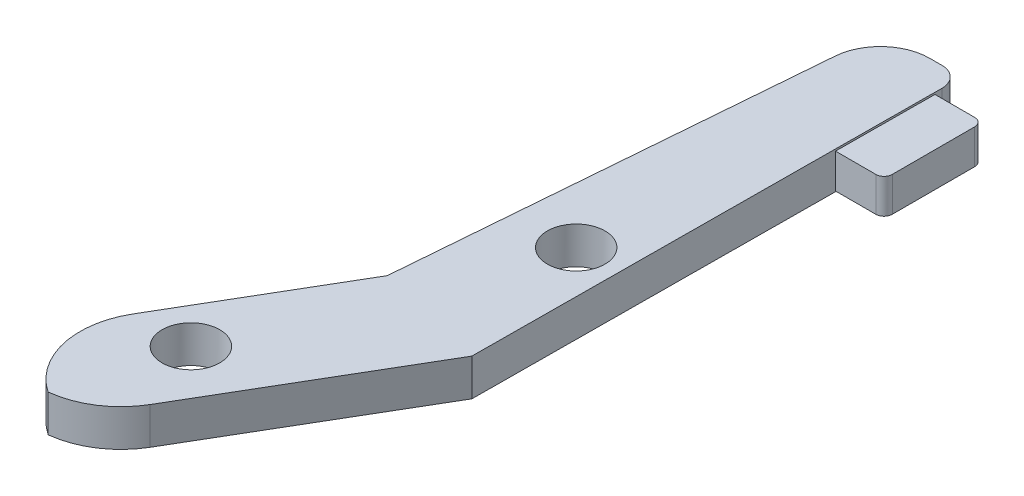
ISO-10303-21;
HEADER;
FILE_DESCRIPTION(('STEP AP214'),'2;1');
FILE_NAME('part.step','',(''),(''),'','','');
FILE_SCHEMA(('AUTOMOTIVE_DESIGN { 1 0 10303 214 1 1 1 1 }'));
ENDSEC;
DATA;
#1=APPLICATION_CONTEXT('core data for automotive mechanical design processes');
#2=APPLICATION_PROTOCOL_DEFINITION('international standard','automotive_design',2000,#1);
#3=PRODUCT_CONTEXT('',#1,'mechanical');
#4=PRODUCT('Part','Part','',(#3));
#5=PRODUCT_RELATED_PRODUCT_CATEGORY('part','',(#4));
#6=PRODUCT_DEFINITION_FORMATION('','',#4);
#7=PRODUCT_DEFINITION_CONTEXT('part definition',#1,'design');
#8=PRODUCT_DEFINITION('design','',#6,#7);
#9=PRODUCT_DEFINITION_SHAPE('','',#8);
#10=(LENGTH_UNIT() NAMED_UNIT(*) SI_UNIT(.MILLI.,.METRE.));
#11=(NAMED_UNIT(*) PLANE_ANGLE_UNIT() SI_UNIT($,.RADIAN.));
#12=(NAMED_UNIT(*) SI_UNIT($,.STERADIAN.) SOLID_ANGLE_UNIT());
#13=UNCERTAINTY_MEASURE_WITH_UNIT(LENGTH_MEASURE(1.E-05),#10,'distance_accuracy_value','');
#14=(GEOMETRIC_REPRESENTATION_CONTEXT(3) GLOBAL_UNCERTAINTY_ASSIGNED_CONTEXT((#13)) GLOBAL_UNIT_ASSIGNED_CONTEXT((#10,
#11,#12)) REPRESENTATION_CONTEXT('',''));
#15=CARTESIAN_POINT('',(0.,0.,0.));
#16=DIRECTION('',(0.,0.,1.));
#17=DIRECTION('',(1.,0.,0.));
#18=AXIS2_PLACEMENT_3D('',#15,#16,#17);
#19=CARTESIAN_POINT('',(15.9043578339676,2.25,-13.8697629262268));
#20=DIRECTION('',(-0.86267544127674,0.,-0.50575792926852));
#21=DIRECTION('',(-0.50575792926852,0.,0.862675441276741));
#22=AXIS2_PLACEMENT_3D('',#19,#20,#21);
#23=PLANE('',#22);
#24=DIRECTION('',(0.50575792926852,0.,-0.86267544127674));
#25=VECTOR('',#24,1.);
#26=CARTESIAN_POINT('',(15.9043578339676,2.25,-13.8697629262268));
#27=LINE('',#26,#25);
#28=CARTESIAN_POINT('',(8.68296696085208,2.25,-1.55217738267079));
#29=VERTEX_POINT('',#28);
#30=CARTESIAN_POINT('',(15.9043578339676,2.25,-13.8697629262268));
#31=VERTEX_POINT('',#30);
#32=EDGE_CURVE('E185',#29,#31,#27,.T.);
#33=ORIENTED_EDGE('',*,*,#32,.F.);
#34=DIRECTION('',(0.,-1.,0.));
#35=VECTOR('',#34,1.);
#36=CARTESIAN_POINT('',(8.68296696085208,2.25,-1.55217738267079));
#37=LINE('',#36,#35);
#38=CARTESIAN_POINT('',(8.68296696085208,0.,-1.55217738267079));
#39=VERTEX_POINT('',#38);
#40=EDGE_CURVE('E227',#29,#39,#37,.T.);
#41=ORIENTED_EDGE('',*,*,#40,.T.);
#42=DIRECTION('',(0.50575792926852,0.,-0.86267544127674));
#43=VECTOR('',#42,1.);
#44=CARTESIAN_POINT('',(15.9043578339676,0.,-13.8697629262268));
#45=LINE('',#44,#43);
#46=CARTESIAN_POINT('',(15.9043578339676,0.,-13.8697629262268));
#47=VERTEX_POINT('',#46);
#48=EDGE_CURVE('E204',#39,#47,#45,.T.);
#49=ORIENTED_EDGE('',*,*,#48,.T.);
#50=DIRECTION('',(0.,-1.,0.));
#51=VECTOR('',#50,1.);
#52=CARTESIAN_POINT('',(15.9043578339676,2.25,-13.8697629262268));
#53=LINE('',#52,#51);
#54=EDGE_CURVE('E223',#31,#47,#53,.T.);
#55=ORIENTED_EDGE('',*,*,#54,.F.);
#56=EDGE_LOOP('',(#33,#41,#49,#55));
#57=FACE_BOUND('',#56,.T.);
#58=ADVANCED_FACE('F39',(#57),#23,.F.);
#59=CARTESIAN_POINT('',(15.9043578339676,2.25,-13.8697629262268));
#60=DIRECTION('',(-0.99997752220081,0.,-0.00670485593638969));
#61=DIRECTION('',(-0.00670485593638969,0.,0.99997752220081));
#62=AXIS2_PLACEMENT_3D('',#59,#60,#61);
#63=PLANE('',#62);
#64=DIRECTION('',(0.,-1.,0.));
#65=VECTOR('',#64,1.);
#66=CARTESIAN_POINT('',(16.0514394846908,2.13615947214331,-35.8058561170146));
#67=LINE('',#66,#65);
#68=CARTESIAN_POINT('',(16.0514394846908,2.13615947214331,-35.8058561170146));
#69=VERTEX_POINT('',#68);
#70=CARTESIAN_POINT('',(16.0514394846908,0.0361594721433132,-35.8058561170146));
#71=VERTEX_POINT('',#70);
#72=EDGE_CURVE('E152',#69,#71,#67,.T.);
#73=ORIENTED_EDGE('',*,*,#72,.F.);
#74=DIRECTION('',(-0.00670485593638969,0.,0.99997752220081));
#75=VECTOR('',#74,1.);
#76=CARTESIAN_POINT('',(16.091382842704,2.13615947214331,-41.7630997257237));
#77=LINE('',#76,#75);
#78=CARTESIAN_POINT('',(16.0916695245919,2.13615947214331,-41.8058561170146));
#79=VERTEX_POINT('',#78);
#80=EDGE_CURVE('E156',#79,#69,#77,.T.);
#81=ORIENTED_EDGE('',*,*,#80,.F.);
#82=DIRECTION('',(0.,1.,0.));
#83=VECTOR('',#82,1.);
#84=CARTESIAN_POINT('',(16.0916695245919,2.13615947214331,-41.8058561170146));
#85=LINE('',#84,#83);
#86=CARTESIAN_POINT('',(16.0916695245919,0.0361594721433136,-41.8058561170146));
#87=VERTEX_POINT('',#86);
#88=EDGE_CURVE('E180',#87,#79,#85,.T.);
#89=ORIENTED_EDGE('',*,*,#88,.F.);
#90=DIRECTION('',(0.00670485593638969,0.,-0.99997752220081));
#91=VECTOR('',#90,1.);
#92=CARTESIAN_POINT('',(16.091382842704,0.0361594721433136,-41.7630997257237));
#93=LINE('',#92,#91);
#94=EDGE_CURVE('E168',#71,#87,#93,.T.);
#95=ORIENTED_EDGE('',*,*,#94,.F.);
#96=EDGE_LOOP('',(#73,#81,#89,#95));
#97=FACE_BOUND('',#96,.T.);
#98=DIRECTION('',(0.00670485593638969,0.,-0.99997752220081));
#99=VECTOR('',#98,1.);
#100=CARTESIAN_POINT('',(15.9043578339676,0.,-13.8697629262268));
#101=LINE('',#100,#99);
#102=CARTESIAN_POINT('',(16.0944943480357,0.,-42.2271567347668));
#103=VERTEX_POINT('',#102);
#104=EDGE_CURVE('E207',#47,#103,#101,.T.);
#105=ORIENTED_EDGE('',*,*,#104,.T.);
#106=DIRECTION('',(0.,-1.,0.));
#107=VECTOR('',#106,1.);
#108=CARTESIAN_POINT('',(16.0944943480357,2.25,-42.2271567347668));
#109=LINE('',#108,#107);
#110=CARTESIAN_POINT('',(16.0944943480357,2.25,-42.2271567347668));
#111=VERTEX_POINT('',#110);
#112=EDGE_CURVE('E271',#103,#111,#109,.F.);
#113=ORIENTED_EDGE('',*,*,#112,.T.);
#114=DIRECTION('',(0.00670485593638969,0.,-0.99997752220081));
#115=VECTOR('',#114,1.);
#116=CARTESIAN_POINT('',(15.9043578339676,2.25,-13.8697629262268));
#117=LINE('',#116,#115);
#118=EDGE_CURVE('E188',#31,#111,#117,.T.);
#119=ORIENTED_EDGE('',*,*,#118,.F.);
#120=ORIENTED_EDGE('',*,*,#54,.T.);
#121=EDGE_LOOP('',(#105,#113,#119,#120));
#122=FACE_BOUND('',#121,.T.);
#123=ADVANCED_FACE('F166',(#97,#122),#63,.F.);
#124=CARTESIAN_POINT('',(16.1025943033403,2.25,-43.4352025618905));
#125=DIRECTION('',(0.,0.,1.));
#126=DIRECTION('',(1.,0.,0.));
#127=AXIS2_PLACEMENT_3D('',#124,#125,#126);
#128=PLANE('',#127);
#129=DIRECTION('',(-1.,0.,0.));
#130=VECTOR('',#129,1.);
#131=CARTESIAN_POINT('',(16.1025943033403,2.25,-43.4352025618905));
#132=LINE('',#131,#130);
#133=CARTESIAN_POINT('',(14.8945213213947,2.25,-43.4352025618905));
#134=VERTEX_POINT('',#133);
#135=CARTESIAN_POINT('',(14.1482346901652,2.25,-43.4352025618905));
#136=VERTEX_POINT('',#135);
#137=EDGE_CURVE('E193',#134,#136,#132,.T.);
#138=ORIENTED_EDGE('',*,*,#137,.F.);
#139=DIRECTION('',(0.,-1.,0.));
#140=VECTOR('',#139,1.);
#141=CARTESIAN_POINT('',(14.8945213213947,2.25,-43.4352025618905));
#142=LINE('',#141,#140);
#143=CARTESIAN_POINT('',(14.8945213213947,0.,-43.4352025618905));
#144=VERTEX_POINT('',#143);
#145=EDGE_CURVE('E264',#134,#144,#142,.T.);
#146=ORIENTED_EDGE('',*,*,#145,.T.);
#147=DIRECTION('',(-1.,0.,0.));
#148=VECTOR('',#147,1.);
#149=CARTESIAN_POINT('',(16.1025943033403,0.,-43.4352025618905));
#150=LINE('',#149,#148);
#151=CARTESIAN_POINT('',(14.1482346901652,0.,-43.4352025618905));
#152=VERTEX_POINT('',#151);
#153=EDGE_CURVE('E211',#144,#152,#150,.T.);
#154=ORIENTED_EDGE('',*,*,#153,.T.);
#155=DIRECTION('',(0.,-1.,0.));
#156=VECTOR('',#155,1.);
#157=CARTESIAN_POINT('',(14.1482346901652,2.25,-43.4352025618905));
#158=LINE('',#157,#156);
#159=EDGE_CURVE('E257',#152,#136,#158,.F.);
#160=ORIENTED_EDGE('',*,*,#159,.T.);
#161=EDGE_LOOP('',(#138,#146,#154,#160));
#162=FACE_BOUND('',#161,.T.);
#163=ADVANCED_FACE('F352',(#162),#128,.F.);
#164=CARTESIAN_POINT('',(9.10364272683336,2.25,-15.5281579429813));
#165=DIRECTION('',(0.996680164961042,0.,0.0814165141309143));
#166=DIRECTION('',(0.0814165141309143,0.,-0.996680164961043));
#167=AXIS2_PLACEMENT_3D('',#164,#165,#166);
#168=PLANE('',#167);
#169=DIRECTION('',(-0.0814165141309143,0.,0.996680164961042));
#170=VECTOR('',#169,1.);
#171=CARTESIAN_POINT('',(9.10364272683336,2.25,-15.5281579429813));
#172=LINE('',#171,#170);
#173=CARTESIAN_POINT('',(11.1581941952821,2.25,-40.6794521042833));
#174=VERTEX_POINT('',#173);
#175=CARTESIAN_POINT('',(9.10364272683336,2.25,-15.5281579429813));
#176=VERTEX_POINT('',#175);
#177=EDGE_CURVE('E196',#174,#176,#172,.T.);
#178=ORIENTED_EDGE('',*,*,#177,.F.);
#179=DIRECTION('',(0.,-1.,0.));
#180=VECTOR('',#179,1.);
#181=CARTESIAN_POINT('',(11.1581941952821,2.25,-40.6794521042833));
#182=LINE('',#181,#180);
#183=CARTESIAN_POINT('',(11.1581941952821,0.,-40.6794521042833));
#184=VERTEX_POINT('',#183);
#185=EDGE_CURVE('E246',#174,#184,#182,.T.);
#186=ORIENTED_EDGE('',*,*,#185,.T.);
#187=DIRECTION('',(-0.0814165141309143,0.,0.996680164961042));
#188=VECTOR('',#187,1.);
#189=CARTESIAN_POINT('',(9.10364272683336,0.,-15.5281579429813));
#190=LINE('',#189,#188);
#191=CARTESIAN_POINT('',(9.10364272683336,0.,-15.5281579429813));
#192=VERTEX_POINT('',#191);
#193=EDGE_CURVE('E214',#184,#192,#190,.T.);
#194=ORIENTED_EDGE('',*,*,#193,.T.);
#195=DIRECTION('',(0.,-1.,0.));
#196=VECTOR('',#195,1.);
#197=CARTESIAN_POINT('',(9.10364272683336,2.25,-15.5281579429813));
#198=LINE('',#197,#196);
#199=EDGE_CURVE('E203',#176,#192,#198,.T.);
#200=ORIENTED_EDGE('',*,*,#199,.F.);
#201=EDGE_LOOP('',(#178,#186,#194,#200));
#202=FACE_BOUND('',#201,.T.);
#203=ADVANCED_FACE('F381',(#202),#168,.F.);
#204=CARTESIAN_POINT('',(0.,2.25,0.));
#205=DIRECTION('',(0.86267544127674,0.,0.50575792926852));
#206=DIRECTION('',(0.50575792926852,0.,-0.86267544127674));
#207=AXIS2_PLACEMENT_3D('',#204,#205,#206);
#208=PLANE('',#207);
#209=DIRECTION('',(-0.50575792926852,0.,0.86267544127674));
#210=VECTOR('',#209,1.);
#211=CARTESIAN_POINT('',(0.,0.,0.));
#212=LINE('',#211,#210);
#213=CARTESIAN_POINT('',(3.39740777134499,0.,-5.79498625475034));
#214=VERTEX_POINT('',#213);
#215=EDGE_CURVE('E189',#192,#214,#212,.T.);
#216=ORIENTED_EDGE('',*,*,#215,.T.);
#217=DIRECTION('',(0.,-1.,0.));
#218=VECTOR('',#217,1.);
#219=CARTESIAN_POINT('',(3.39740777134499,2.25,-5.79498625475034));
#220=LINE('',#219,#218);
#221=CARTESIAN_POINT('',(3.39740777134499,2.25,-5.79498625475034));
#222=VERTEX_POINT('',#221);
#223=EDGE_CURVE('E243',#214,#222,#220,.F.);
#224=ORIENTED_EDGE('',*,*,#223,.T.);
#225=DIRECTION('',(-0.50575792926852,0.,0.86267544127674));
#226=VECTOR('',#225,1.);
#227=CARTESIAN_POINT('',(0.,2.25,0.));
#228=LINE('',#227,#226);
#229=EDGE_CURVE('E199',#176,#222,#228,.T.);
#230=ORIENTED_EDGE('',*,*,#229,.F.);
#231=ORIENTED_EDGE('',*,*,#199,.T.);
#232=EDGE_LOOP('',(#216,#224,#230,#231));
#233=FACE_BOUND('',#232,.T.);
#234=ADVANCED_FACE('F386',(#233),#208,.F.);
#235=CARTESIAN_POINT('',(0.,2.25,0.));
#236=DIRECTION('',(0.,-1.,0.));
#237=DIRECTION('',(0.,0.,-1.));
#238=AXIS2_PLACEMENT_3D('',#235,#236,#237);
#239=PLANE('',#238);
#240=CARTESIAN_POINT('',(6.85749469277538,2.25,-5.85306873744301));
#241=DIRECTION('',(0.,1.,0.));
#242=DIRECTION('',(0.,0.,1.));
#243=AXIS2_PLACEMENT_3D('',#240,#241,#242);
#244=CIRCLE('',#243,1.75);
#245=CARTESIAN_POINT('',(6.85749469277538,2.25,-4.10306873744301));
#246=VERTEX_POINT('',#245);
#247=EDGE_CURVE('E299',#246,#246,#244,.T.);
#248=ORIENTED_EDGE('',*,*,#247,.F.);
#249=EDGE_LOOP('',(#248));
#250=FACE_BOUND('',#249,.T.);
#251=CARTESIAN_POINT('',(13.3623562682317,2.25,-22.7473971218828));
#252=DIRECTION('',(0.,1.,0.));
#253=DIRECTION('',(0.,0.,1.));
#254=AXIS2_PLACEMENT_3D('',#251,#252,#253);
#255=CIRCLE('',#254,1.75);
#256=CARTESIAN_POINT('',(13.3623562682317,2.25,-20.9973971218828));
#257=VERTEX_POINT('',#256);
#258=EDGE_CURVE('E307',#257,#257,#255,.T.);
#259=ORIENTED_EDGE('',*,*,#258,.F.);
#260=EDGE_LOOP('',(#259));
#261=FACE_BOUND('',#260,.T.);
#262=ORIENTED_EDGE('',*,*,#118,.T.);
#263=CARTESIAN_POINT('',(14.8945213213947,2.25,-42.2352025618905));
#264=DIRECTION('',(0.,-1.,0.));
#265=DIRECTION('',(0.,0.,-1.));
#266=AXIS2_PLACEMENT_3D('',#263,#264,#265);
#267=CIRCLE('',#266,1.2);
#268=EDGE_CURVE('E274',#111,#134,#267,.F.);
#269=ORIENTED_EDGE('',*,*,#268,.T.);
#270=ORIENTED_EDGE('',*,*,#137,.T.);
#271=CARTESIAN_POINT('',(14.1482346901652,2.25,-40.4352025618905));
#272=DIRECTION('',(0.,-1.,0.));
#273=DIRECTION('',(0.,0.,-1.));
#274=AXIS2_PLACEMENT_3D('',#271,#272,#273);
#275=CIRCLE('',#274,3.);
#276=EDGE_CURVE('E261',#136,#174,#275,.F.);
#277=ORIENTED_EDGE('',*,*,#276,.T.);
#278=ORIENTED_EDGE('',*,*,#177,.T.);
#279=ORIENTED_EDGE('',*,*,#229,.T.);
#280=CARTESIAN_POINT('',(7.71078497772869,2.25,-3.26619660840774));
#281=DIRECTION('',(0.,-1.,0.));
#282=DIRECTION('',(0.,0.,-1.));
#283=AXIS2_PLACEMENT_3D('',#280,#281,#282);
#284=CIRCLE('',#283,5.);
#285=CARTESIAN_POINT('',(4.92787521253947,2.25,0.887766949306077));
#286=VERTEX_POINT('',#285);
#287=EDGE_CURVE('E237',#222,#286,#284,.F.);
#288=ORIENTED_EDGE('',*,*,#287,.T.);
#289=CARTESIAN_POINT('',(4.36958975446838,2.25,-4.08096702901338));
#290=DIRECTION('',(0.,-1.,0.));
#291=DIRECTION('',(0.,0.,-1.));
#292=AXIS2_PLACEMENT_3D('',#289,#290,#291);
#293=CIRCLE('',#292,5.);
#294=EDGE_CURVE('E240',#286,#29,#293,.F.);
#295=ORIENTED_EDGE('',*,*,#294,.T.);
#296=ORIENTED_EDGE('',*,*,#32,.T.);
#297=EDGE_LOOP('',(#262,#269,#270,#277,#278,#279,#288,#295,#296));
#298=FACE_BOUND('',#297,.T.);
#299=ADVANCED_FACE('F377',(#250,#261,#298),#239,.F.);
#300=CARTESIAN_POINT('',(0.,0.,0.));
#301=DIRECTION('',(0.,-1.,0.));
#302=DIRECTION('',(0.,0.,-1.));
#303=AXIS2_PLACEMENT_3D('',#300,#301,#302);
#304=PLANE('',#303);
#305=CARTESIAN_POINT('',(6.85749469277538,0.,-5.85306873744301));
#306=DIRECTION('',(0.,-1.,0.));
#307=DIRECTION('',(0.,0.,-1.));
#308=AXIS2_PLACEMENT_3D('',#305,#306,#307);
#309=CIRCLE('',#308,1.75);
#310=CARTESIAN_POINT('',(6.85749469277538,0.,-7.60306873744301));
#311=VERTEX_POINT('',#310);
#312=EDGE_CURVE('E43',#311,#311,#309,.T.);
#313=ORIENTED_EDGE('',*,*,#312,.F.);
#314=EDGE_LOOP('',(#313));
#315=FACE_BOUND('',#314,.T.);
#316=CARTESIAN_POINT('',(13.3623562682317,0.,-22.7473971218828));
#317=DIRECTION('',(0.,-1.,0.));
#318=DIRECTION('',(0.,0.,-1.));
#319=AXIS2_PLACEMENT_3D('',#316,#317,#318);
#320=CIRCLE('',#319,1.75);
#321=CARTESIAN_POINT('',(13.3623562682317,0.,-24.4973971218828));
#322=VERTEX_POINT('',#321);
#323=EDGE_CURVE('E296',#322,#322,#320,.T.);
#324=ORIENTED_EDGE('',*,*,#323,.F.);
#325=EDGE_LOOP('',(#324));
#326=FACE_BOUND('',#325,.T.);
#327=ORIENTED_EDGE('',*,*,#153,.F.);
#328=CARTESIAN_POINT('',(14.8945213213947,0.,-42.2352025618905));
#329=DIRECTION('',(0.,-1.,0.));
#330=DIRECTION('',(0.,0.,-1.));
#331=AXIS2_PLACEMENT_3D('',#328,#329,#330);
#332=CIRCLE('',#331,1.2);
#333=EDGE_CURVE('E268',#144,#103,#332,.T.);
#334=ORIENTED_EDGE('',*,*,#333,.T.);
#335=ORIENTED_EDGE('',*,*,#104,.F.);
#336=ORIENTED_EDGE('',*,*,#48,.F.);
#337=CARTESIAN_POINT('',(4.36958975446838,0.,-4.08096702901338));
#338=DIRECTION('',(0.,-1.,0.));
#339=DIRECTION('',(0.,0.,-1.));
#340=AXIS2_PLACEMENT_3D('',#337,#338,#339);
#341=CIRCLE('',#340,5.);
#342=CARTESIAN_POINT('',(4.92787521253947,0.,0.887766949306077));
#343=VERTEX_POINT('',#342);
#344=EDGE_CURVE('E234',#39,#343,#341,.T.);
#345=ORIENTED_EDGE('',*,*,#344,.T.);
#346=CARTESIAN_POINT('',(7.71078497772869,0.,-3.26619660840774));
#347=DIRECTION('',(0.,-1.,0.));
#348=DIRECTION('',(0.,0.,-1.));
#349=AXIS2_PLACEMENT_3D('',#346,#347,#348);
#350=CIRCLE('',#349,5.);
#351=EDGE_CURVE('E231',#343,#214,#350,.T.);
#352=ORIENTED_EDGE('',*,*,#351,.T.);
#353=ORIENTED_EDGE('',*,*,#215,.F.);
#354=ORIENTED_EDGE('',*,*,#193,.F.);
#355=CARTESIAN_POINT('',(14.1482346901652,0.,-40.4352025618905));
#356=DIRECTION('',(0.,-1.,0.));
#357=DIRECTION('',(0.,0.,-1.));
#358=AXIS2_PLACEMENT_3D('',#355,#356,#357);
#359=CIRCLE('',#358,3.);
#360=EDGE_CURVE('E253',#184,#152,#359,.T.);
#361=ORIENTED_EDGE('',*,*,#360,.T.);
#362=EDGE_LOOP('',(#327,#334,#335,#336,#345,#352,#353,#354,#361));
#363=FACE_BOUND('',#362,.T.);
#364=ADVANCED_FACE('F364',(#315,#326,#363),#304,.T.);
#365=CARTESIAN_POINT('',(7.71078497772869,2.25,-3.26619660840774));
#366=DIRECTION('',(0.,-1.,0.));
#367=DIRECTION('',(0.,0.,-1.));
#368=AXIS2_PLACEMENT_3D('',#365,#366,#367);
#369=CYLINDRICAL_SURFACE('',#368,5.);
#370=DIRECTION('',(0.,-1.,0.));
#371=VECTOR('',#370,1.);
#372=CARTESIAN_POINT('',(4.92787521253947,1.125,0.887766949306077));
#373=LINE('',#372,#371);
#374=EDGE_CURVE('E184',#286,#343,#373,.T.);
#375=ORIENTED_EDGE('',*,*,#374,.F.);
#376=ORIENTED_EDGE('',*,*,#287,.F.);
#377=ORIENTED_EDGE('',*,*,#223,.F.);
#378=ORIENTED_EDGE('',*,*,#351,.F.);
#379=EDGE_LOOP('',(#375,#376,#377,#378));
#380=FACE_BOUND('',#379,.T.);
#381=ADVANCED_FACE('F360',(#380),#369,.T.);
#382=CARTESIAN_POINT('',(4.36958975446838,2.25,-4.08096702901338));
#383=DIRECTION('',(0.,-1.,0.));
#384=DIRECTION('',(0.,0.,-1.));
#385=AXIS2_PLACEMENT_3D('',#382,#383,#384);
#386=CYLINDRICAL_SURFACE('',#385,5.);
#387=ORIENTED_EDGE('',*,*,#294,.F.);
#388=ORIENTED_EDGE('',*,*,#374,.T.);
#389=ORIENTED_EDGE('',*,*,#344,.F.);
#390=ORIENTED_EDGE('',*,*,#40,.F.);
#391=EDGE_LOOP('',(#387,#388,#389,#390));
#392=FACE_BOUND('',#391,.T.);
#393=ADVANCED_FACE('F357',(#392),#386,.T.);
#394=CARTESIAN_POINT('',(19.,0.,0.));
#395=DIRECTION('',(-1.,0.,0.));
#396=DIRECTION('',(0.,0.,1.));
#397=AXIS2_PLACEMENT_3D('',#394,#395,#396);
#398=PLANE('',#397);
#399=DIRECTION('',(0.,0.,1.));
#400=VECTOR('',#399,1.);
#401=CARTESIAN_POINT('',(19.,2.13615947214331,-41.8058561170146));
#402=LINE('',#401,#400);
#403=CARTESIAN_POINT('',(19.,2.13615947214331,-41.3058561170146));
#404=VERTEX_POINT('',#403);
#405=CARTESIAN_POINT('',(19.,2.13615947214331,-36.3058561170146));
#406=VERTEX_POINT('',#405);
#407=EDGE_CURVE('E305',#404,#406,#402,.T.);
#408=ORIENTED_EDGE('',*,*,#407,.T.);
#409=DIRECTION('',(0.,-1.,0.));
#410=VECTOR('',#409,1.);
#411=CARTESIAN_POINT('',(19.,0.036159472143313,-36.3058561170146));
#412=LINE('',#411,#410);
#413=CARTESIAN_POINT('',(19.,0.036159472143313,-36.3058561170146));
#414=VERTEX_POINT('',#413);
#415=EDGE_CURVE('E281',#406,#414,#412,.T.);
#416=ORIENTED_EDGE('',*,*,#415,.T.);
#417=DIRECTION('',(0.,0.,-1.));
#418=VECTOR('',#417,1.);
#419=CARTESIAN_POINT('',(19.,0.0361594721433136,-41.8058561170146));
#420=LINE('',#419,#418);
#421=CARTESIAN_POINT('',(19.,0.0361594721433136,-41.3058561170146));
#422=VERTEX_POINT('',#421);
#423=EDGE_CURVE('E164',#414,#422,#420,.T.);
#424=ORIENTED_EDGE('',*,*,#423,.T.);
#425=DIRECTION('',(0.,1.,0.));
#426=VECTOR('',#425,1.);
#427=CARTESIAN_POINT('',(19.,2.13615947214331,-41.3058561170146));
#428=LINE('',#427,#426);
#429=EDGE_CURVE('E277',#422,#404,#428,.T.);
#430=ORIENTED_EDGE('',*,*,#429,.T.);
#431=EDGE_LOOP('',(#408,#416,#424,#430));
#432=FACE_BOUND('',#431,.T.);
#433=ADVANCED_FACE('F332',(#432),#398,.F.);
#434=CARTESIAN_POINT('',(9.7145970285065,2.13615947214331,-41.8058561170146));
#435=DIRECTION('',(0.,1.,0.));
#436=DIRECTION('',(0.,0.,1.));
#437=AXIS2_PLACEMENT_3D('',#434,#435,#436);
#438=PLANE('',#437);
#439=DIRECTION('',(1.,0.,0.));
#440=VECTOR('',#439,1.);
#441=CARTESIAN_POINT('',(9.7145970285065,2.13615947214331,-35.8058561170146));
#442=LINE('',#441,#440);
#443=CARTESIAN_POINT('',(18.5,2.13615947214331,-35.8058561170146));
#444=VERTEX_POINT('',#443);
#445=EDGE_CURVE('E148',#69,#444,#442,.T.);
#446=ORIENTED_EDGE('',*,*,#445,.T.);
#447=CARTESIAN_POINT('',(18.5,2.13615947214331,-36.3058561170146));
#448=DIRECTION('',(0.,1.,0.));
#449=DIRECTION('',(0.,0.,1.));
#450=AXIS2_PLACEMENT_3D('',#447,#448,#449);
#451=CIRCLE('',#450,0.5);
#452=EDGE_CURVE('E49',#444,#406,#451,.T.);
#453=ORIENTED_EDGE('',*,*,#452,.T.);
#454=ORIENTED_EDGE('',*,*,#407,.F.);
#455=CARTESIAN_POINT('',(18.5,2.13615947214331,-41.3058561170146));
#456=DIRECTION('',(0.,1.,0.));
#457=DIRECTION('',(0.,0.,1.));
#458=AXIS2_PLACEMENT_3D('',#455,#456,#457);
#459=CIRCLE('',#458,0.5);
#460=CARTESIAN_POINT('',(18.5,2.13615947214331,-41.8058561170146));
#461=VERTEX_POINT('',#460);
#462=EDGE_CURVE('E57',#404,#461,#459,.T.);
#463=ORIENTED_EDGE('',*,*,#462,.T.);
#464=DIRECTION('',(1.,0.,0.));
#465=VECTOR('',#464,1.);
#466=CARTESIAN_POINT('',(9.7145970285065,2.13615947214331,-41.8058561170146));
#467=LINE('',#466,#465);
#468=EDGE_CURVE('E160',#79,#461,#467,.T.);
#469=ORIENTED_EDGE('',*,*,#468,.F.);
#470=ORIENTED_EDGE('',*,*,#80,.T.);
#471=EDGE_LOOP('',(#446,#453,#454,#463,#469,#470));
#472=FACE_BOUND('',#471,.T.);
#473=ADVANCED_FACE('F159',(#472),#438,.T.);
#474=CARTESIAN_POINT('',(9.7145970285065,2.13615947214331,-35.8058561170146));
#475=DIRECTION('',(0.,0.,1.));
#476=DIRECTION('',(1.,0.,0.));
#477=AXIS2_PLACEMENT_3D('',#474,#475,#476);
#478=PLANE('',#477);
#479=DIRECTION('',(1.,0.,0.));
#480=VECTOR('',#479,1.);
#481=CARTESIAN_POINT('',(9.7145970285065,0.036159472143313,-35.8058561170146));
#482=LINE('',#481,#480);
#483=CARTESIAN_POINT('',(18.5,0.036159472143313,-35.8058561170146));
#484=VERTEX_POINT('',#483);
#485=EDGE_CURVE('E170',#71,#484,#482,.T.);
#486=ORIENTED_EDGE('',*,*,#485,.T.);
#487=DIRECTION('',(0.,-1.,0.));
#488=VECTOR('',#487,1.);
#489=CARTESIAN_POINT('',(18.5,2.13615947214331,-35.8058561170146));
#490=LINE('',#489,#488);
#491=EDGE_CURVE('E65',#484,#444,#490,.F.);
#492=ORIENTED_EDGE('',*,*,#491,.T.);
#493=ORIENTED_EDGE('',*,*,#445,.F.);
#494=ORIENTED_EDGE('',*,*,#72,.T.);
#495=EDGE_LOOP('',(#486,#492,#493,#494));
#496=FACE_BOUND('',#495,.T.);
#497=ADVANCED_FACE('F150',(#496),#478,.T.);
#498=CARTESIAN_POINT('',(9.7145970285065,0.0361594721433136,-41.8058561170146));
#499=DIRECTION('',(0.,-1.,0.));
#500=DIRECTION('',(0.,0.,-1.));
#501=AXIS2_PLACEMENT_3D('',#498,#499,#500);
#502=PLANE('',#501);
#503=ORIENTED_EDGE('',*,*,#423,.F.);
#504=CARTESIAN_POINT('',(18.5,0.036159472143313,-36.3058561170146));
#505=DIRECTION('',(0.,-1.,0.));
#506=DIRECTION('',(0.,0.,-1.));
#507=AXIS2_PLACEMENT_3D('',#504,#505,#506);
#508=CIRCLE('',#507,0.5);
#509=EDGE_CURVE('E288',#414,#484,#508,.T.);
#510=ORIENTED_EDGE('',*,*,#509,.T.);
#511=ORIENTED_EDGE('',*,*,#485,.F.);
#512=ORIENTED_EDGE('',*,*,#94,.T.);
#513=DIRECTION('',(1.,0.,0.));
#514=VECTOR('',#513,1.);
#515=CARTESIAN_POINT('',(9.7145970285065,0.0361594721433136,-41.8058561170146));
#516=LINE('',#515,#514);
#517=CARTESIAN_POINT('',(18.5,0.0361594721433136,-41.8058561170146));
#518=VERTEX_POINT('',#517);
#519=EDGE_CURVE('E177',#87,#518,#516,.T.);
#520=ORIENTED_EDGE('',*,*,#519,.T.);
#521=CARTESIAN_POINT('',(18.5,0.0361594721433136,-41.3058561170146));
#522=DIRECTION('',(0.,-1.,0.));
#523=DIRECTION('',(0.,0.,-1.));
#524=AXIS2_PLACEMENT_3D('',#521,#522,#523);
#525=CIRCLE('',#524,0.5);
#526=EDGE_CURVE('E285',#518,#422,#525,.T.);
#527=ORIENTED_EDGE('',*,*,#526,.T.);
#528=EDGE_LOOP('',(#503,#510,#511,#512,#520,#527));
#529=FACE_BOUND('',#528,.T.);
#530=ADVANCED_FACE('F328',(#529),#502,.T.);
#531=CARTESIAN_POINT('',(9.7145970285065,2.13615947214331,-41.8058561170146));
#532=DIRECTION('',(0.,0.,-1.));
#533=DIRECTION('',(-1.,0.,0.));
#534=AXIS2_PLACEMENT_3D('',#531,#532,#533);
#535=PLANE('',#534);
#536=ORIENTED_EDGE('',*,*,#468,.T.);
#537=DIRECTION('',(0.,1.,0.));
#538=VECTOR('',#537,1.);
#539=CARTESIAN_POINT('',(18.5,0.0361594721433136,-41.8058561170146));
#540=LINE('',#539,#538);
#541=EDGE_CURVE('E11',#461,#518,#540,.F.);
#542=ORIENTED_EDGE('',*,*,#541,.T.);
#543=ORIENTED_EDGE('',*,*,#519,.F.);
#544=ORIENTED_EDGE('',*,*,#88,.T.);
#545=EDGE_LOOP('',(#536,#542,#543,#544));
#546=FACE_BOUND('',#545,.T.);
#547=ADVANCED_FACE('F323',(#546),#535,.T.);
#548=CARTESIAN_POINT('',(14.1482346901652,2.25,-40.4352025618905));
#549=DIRECTION('',(0.,-1.,0.));
#550=DIRECTION('',(0.,0.,-1.));
#551=AXIS2_PLACEMENT_3D('',#548,#549,#550);
#552=CYLINDRICAL_SURFACE('',#551,3.);
#553=ORIENTED_EDGE('',*,*,#276,.F.);
#554=ORIENTED_EDGE('',*,*,#159,.F.);
#555=ORIENTED_EDGE('',*,*,#360,.F.);
#556=ORIENTED_EDGE('',*,*,#185,.F.);
#557=EDGE_LOOP('',(#553,#554,#555,#556));
#558=FACE_BOUND('',#557,.T.);
#559=ADVANCED_FACE('F343',(#558),#552,.T.);
#560=CARTESIAN_POINT('',(14.8945213213947,2.25,-42.2352025618905));
#561=DIRECTION('',(0.,-1.,0.));
#562=DIRECTION('',(0.,0.,-1.));
#563=AXIS2_PLACEMENT_3D('',#560,#561,#562);
#564=CYLINDRICAL_SURFACE('',#563,1.2);
#565=ORIENTED_EDGE('',*,*,#268,.F.);
#566=ORIENTED_EDGE('',*,*,#112,.F.);
#567=ORIENTED_EDGE('',*,*,#333,.F.);
#568=ORIENTED_EDGE('',*,*,#145,.F.);
#569=EDGE_LOOP('',(#565,#566,#567,#568));
#570=FACE_BOUND('',#569,.T.);
#571=ADVANCED_FACE('F337',(#570),#564,.T.);
#572=CARTESIAN_POINT('',(18.5,0.,-36.3058561170146));
#573=DIRECTION('',(0.,1.,0.));
#574=DIRECTION('',(0.,0.,1.));
#575=AXIS2_PLACEMENT_3D('',#572,#573,#574);
#576=CYLINDRICAL_SURFACE('',#575,0.5);
#577=ORIENTED_EDGE('',*,*,#452,.F.);
#578=ORIENTED_EDGE('',*,*,#491,.F.);
#579=ORIENTED_EDGE('',*,*,#509,.F.);
#580=ORIENTED_EDGE('',*,*,#415,.F.);
#581=EDGE_LOOP('',(#577,#578,#579,#580));
#582=FACE_BOUND('',#581,.T.);
#583=ADVANCED_FACE('F335',(#582),#576,.T.);
#584=CARTESIAN_POINT('',(18.5,0.,-41.3058561170146));
#585=DIRECTION('',(0.,-1.,0.));
#586=DIRECTION('',(0.,0.,-1.));
#587=AXIS2_PLACEMENT_3D('',#584,#585,#586);
#588=CYLINDRICAL_SURFACE('',#587,0.5);
#589=ORIENTED_EDGE('',*,*,#526,.F.);
#590=ORIENTED_EDGE('',*,*,#541,.F.);
#591=ORIENTED_EDGE('',*,*,#462,.F.);
#592=ORIENTED_EDGE('',*,*,#429,.F.);
#593=EDGE_LOOP('',(#589,#590,#591,#592));
#594=FACE_BOUND('',#593,.T.);
#595=ADVANCED_FACE('F41',(#594),#588,.T.);
#596=CARTESIAN_POINT('',(13.3623562682317,-7.75,-22.7473971218828));
#597=DIRECTION('',(0.,1.,0.));
#598=DIRECTION('',(0.,0.,1.));
#599=AXIS2_PLACEMENT_3D('',#596,#597,#598);
#600=CYLINDRICAL_SURFACE('',#599,1.75);
#601=ORIENTED_EDGE('',*,*,#323,.T.);
#602=EDGE_LOOP('',(#601));
#603=FACE_BOUND('',#602,.T.);
#604=ORIENTED_EDGE('',*,*,#258,.T.);
#605=EDGE_LOOP('',(#604));
#606=FACE_BOUND('',#605,.T.);
#607=ADVANCED_FACE('F342',(#603,#606),#600,.F.);
#608=CARTESIAN_POINT('',(6.85749469277538,-7.75,-5.85306873744301));
#609=DIRECTION('',(0.,1.,0.));
#610=DIRECTION('',(0.,0.,1.));
#611=AXIS2_PLACEMENT_3D('',#608,#609,#610);
#612=CYLINDRICAL_SURFACE('',#611,1.75);
#613=ORIENTED_EDGE('',*,*,#312,.T.);
#614=EDGE_LOOP('',(#613));
#615=FACE_BOUND('',#614,.T.);
#616=ORIENTED_EDGE('',*,*,#247,.T.);
#617=EDGE_LOOP('',(#616));
#618=FACE_BOUND('',#617,.T.);
#619=ADVANCED_FACE('F455',(#615,#618),#612,.F.);
#620=CLOSED_SHELL('',(#58,#123,#163,#203,#234,#299,#364,#381,#393,#433,#473,#497,#530,#547,#559,
#571,#583,#595,#607,#619));
#621=MANIFOLD_SOLID_BREP('B2',#620);
#622=ADVANCED_BREP_SHAPE_REPRESENTATION('',(#18,#621),#14);
#623=SHAPE_DEFINITION_REPRESENTATION(#9,#622);
ENDSEC;
END-ISO-10303-21;
